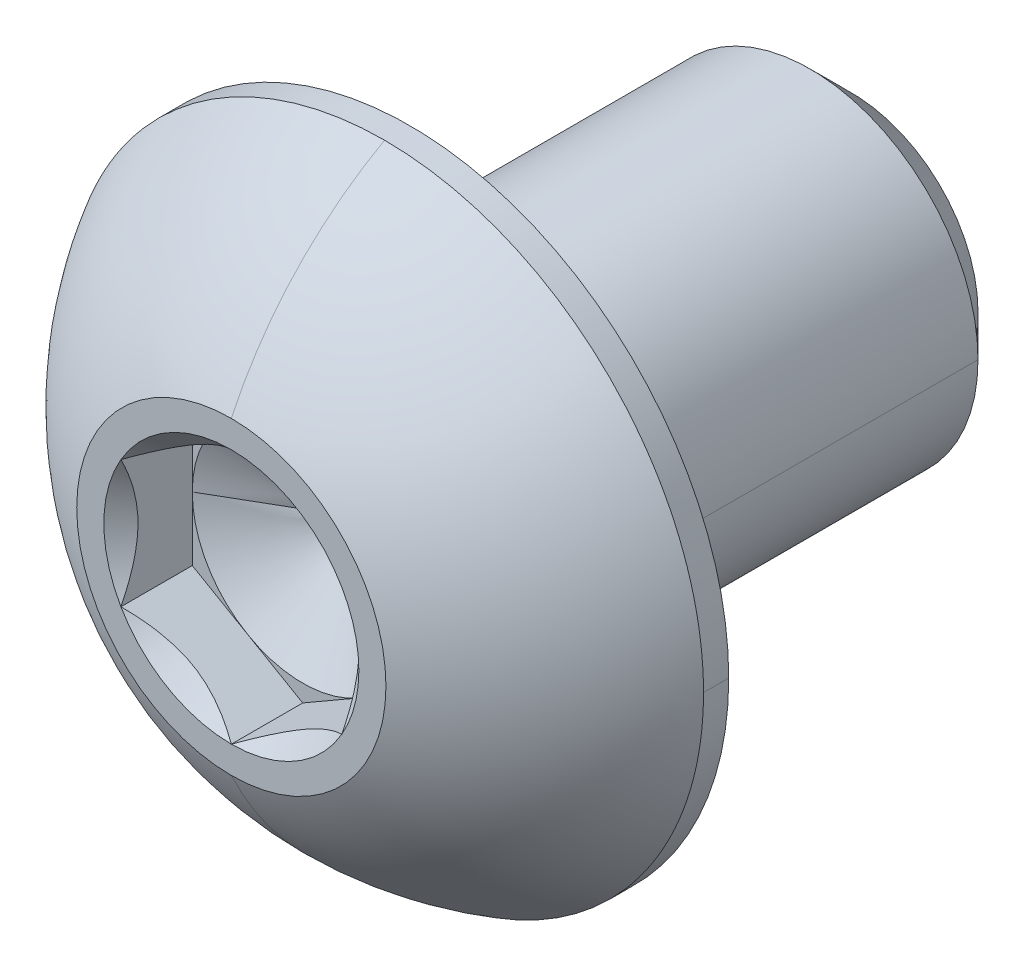
ISO-10303-21;
HEADER;
FILE_DESCRIPTION(('STEP AP214'),'2;1');
FILE_NAME('part.step','',(''),(''),'','','');
FILE_SCHEMA(('AUTOMOTIVE_DESIGN { 1 0 10303 214 1 1 1 1 }'));
ENDSEC;
DATA;
#1=APPLICATION_CONTEXT('core data for automotive mechanical design processes');
#2=APPLICATION_PROTOCOL_DEFINITION('international standard','automotive_design',2000,#1);
#3=PRODUCT_CONTEXT('',#1,'mechanical');
#4=PRODUCT('Part','Part','',(#3));
#5=PRODUCT_RELATED_PRODUCT_CATEGORY('part','',(#4));
#6=PRODUCT_DEFINITION_FORMATION('','',#4);
#7=PRODUCT_DEFINITION_CONTEXT('part definition',#1,'design');
#8=PRODUCT_DEFINITION('design','',#6,#7);
#9=PRODUCT_DEFINITION_SHAPE('','',#8);
#10=(LENGTH_UNIT() NAMED_UNIT(*) SI_UNIT(.MILLI.,.METRE.));
#11=(NAMED_UNIT(*) PLANE_ANGLE_UNIT() SI_UNIT($,.RADIAN.));
#12=(NAMED_UNIT(*) SI_UNIT($,.STERADIAN.) SOLID_ANGLE_UNIT());
#13=UNCERTAINTY_MEASURE_WITH_UNIT(LENGTH_MEASURE(1.E-05),#10,'distance_accuracy_value','');
#14=(GEOMETRIC_REPRESENTATION_CONTEXT(3) GLOBAL_UNCERTAINTY_ASSIGNED_CONTEXT((#13)) GLOBAL_UNIT_ASSIGNED_CONTEXT((#10,
#11,#12)) REPRESENTATION_CONTEXT('',''));
#15=CARTESIAN_POINT('',(0.,0.,0.));
#16=DIRECTION('',(0.,0.,1.));
#17=DIRECTION('',(1.,0.,0.));
#18=AXIS2_PLACEMENT_3D('',#15,#16,#17);
#19=CARTESIAN_POINT('',(0.,0.,4.4577));
#20=DIRECTION('',(0.,0.,1.));
#21=DIRECTION('',(1.,0.,0.));
#22=AXIS2_PLACEMENT_3D('',#19,#20,#21);
#23=CONICAL_SURFACE('',#22,1.83308710467706,0.78539816339745);
#24=CARTESIAN_POINT('',(0.,0.,4.4577));
#25=DIRECTION('',(0.,0.,1.));
#26=DIRECTION('',(1.,0.,0.));
#27=AXIS2_PLACEMENT_3D('',#24,#25,#26);
#28=CIRCLE('',#27,1.83308710467706);
#29=CARTESIAN_POINT('',(1.5875,0.916543552338531,4.4577));
#30=VERTEX_POINT('',#29);
#31=CARTESIAN_POINT('',(0.,1.83308710467706,4.4577));
#32=VERTEX_POINT('',#31);
#33=EDGE_CURVE('E561',#30,#32,#28,.T.);
#34=ORIENTED_EDGE('',*,*,#33,.T.);
#35=CARTESIAN_POINT('',(1.5875,0.916543552338532,4.4577));
#36=CARTESIAN_POINT('',(1.16394825928765,1.16108126385454,4.21316228848399));
#37=CARTESIAN_POINT('',(0.796673872668185,1.37312722983574,4.21211648546325));
#38=CARTESIAN_POINT('',(0.427185428296567,1.58645148265615,4.21106437797813));
#39=CARTESIAN_POINT('',(0.,1.83308710467706,4.4577));
#40=B_SPLINE_CURVE_WITH_KNOTS('',2,(#35,#36,#37,#38,#39),.UNSPECIFIED.,.F.,.F.,(3,2,3),(0.,0.5,
1.),.UNSPECIFIED.);
#41=EDGE_CURVE('E398',#30,#32,#40,.T.);
#42=ORIENTED_EDGE('',*,*,#41,.F.);
#43=EDGE_LOOP('',(#34,#42));
#44=FACE_BOUND('',#43,.T.);
#45=ADVANCED_FACE('F16',(#44),#23,.F.);
#46=CARTESIAN_POINT('',(0.,0.,4.4577));
#47=DIRECTION('',(0.,0.,1.));
#48=DIRECTION('',(1.,0.,0.));
#49=AXIS2_PLACEMENT_3D('',#46,#47,#48);
#50=CONICAL_SURFACE('',#49,1.83308710467706,0.78539816339745);
#51=DIRECTION('',(0.707106781186549,0.,0.707106781186546));
#52=VECTOR('',#51,1.);
#53=CARTESIAN_POINT('',(1.83308710467706,0.,4.4577));
#54=LINE('',#53,#52);
#55=CARTESIAN_POINT('',(1.5875,0.,4.21211289532294));
#56=VERTEX_POINT('',#55);
#57=CARTESIAN_POINT('',(1.83308710467706,0.,4.4577));
#58=VERTEX_POINT('',#57);
#59=EDGE_CURVE('E327',#56,#58,#54,.T.);
#60=ORIENTED_EDGE('',*,*,#59,.F.);
#61=CARTESIAN_POINT('',(1.5875,-0.916543552338531,4.4577));
#62=CARTESIAN_POINT('',(1.5875,-0.684378986321822,4.34161771699165));
#63=CARTESIAN_POINT('',(1.5875,-0.471870631820659,4.28075846355504));
#64=CARTESIAN_POINT('',(1.5875,-0.232174021608445,4.21211289532294));
#65=CARTESIAN_POINT('',(1.5875,0.,4.21211289532294));
#66=B_SPLINE_CURVE_WITH_KNOTS('',2,(#61,#62,#63,#64,#65),.UNSPECIFIED.,.F.,.F.,(3,2,3),(0.,0.5,
1.),.UNSPECIFIED.);
#67=CARTESIAN_POINT('',(1.5875,-0.916543552338531,4.4577));
#68=VERTEX_POINT('',#67);
#69=EDGE_CURVE('E164',#68,#56,#66,.T.);
#70=ORIENTED_EDGE('',*,*,#69,.F.);
#71=CARTESIAN_POINT('',(0.,0.,4.4577));
#72=DIRECTION('',(0.,0.,1.));
#73=DIRECTION('',(1.,0.,0.));
#74=AXIS2_PLACEMENT_3D('',#71,#72,#73);
#75=CIRCLE('',#74,1.83308710467706);
#76=EDGE_CURVE('E554',#68,#58,#75,.T.);
#77=ORIENTED_EDGE('',*,*,#76,.T.);
#78=EDGE_LOOP('',(#60,#70,#77));
#79=FACE_BOUND('',#78,.T.);
#80=ADVANCED_FACE('F18',(#79),#50,.F.);
#81=CARTESIAN_POINT('',(0.,0.,4.4577));
#82=DIRECTION('',(0.,0.,1.));
#83=DIRECTION('',(1.,0.,0.));
#84=AXIS2_PLACEMENT_3D('',#81,#82,#83);
#85=CONICAL_SURFACE('',#84,1.83308710467706,0.78539816339745);
#86=CARTESIAN_POINT('',(0.,0.,4.4577));
#87=DIRECTION('',(0.,0.,1.));
#88=DIRECTION('',(1.,0.,0.));
#89=AXIS2_PLACEMENT_3D('',#86,#87,#88);
#90=CIRCLE('',#89,1.83308710467706);
#91=CARTESIAN_POINT('',(0.,-1.83308710467706,4.4577));
#92=VERTEX_POINT('',#91);
#93=EDGE_CURVE('E546',#92,#68,#90,.T.);
#94=ORIENTED_EDGE('',*,*,#93,.T.);
#95=CARTESIAN_POINT('',(0.,-1.83308710467706,4.4577));
#96=CARTESIAN_POINT('',(0.423551740712977,-1.58854939316069,4.21316228848364));
#97=CARTESIAN_POINT('',(0.790826127331815,-1.37650342717985,4.21211648546325));
#98=CARTESIAN_POINT('',(1.16031457170405,-1.16317917435908,4.21106437797848));
#99=CARTESIAN_POINT('',(1.5875,-0.91654355233853,4.4577));
#100=B_SPLINE_CURVE_WITH_KNOTS('',2,(#95,#96,#97,#98,#99),.UNSPECIFIED.,.F.,.F.,(3,2,3),(0.,0.5,
1.),.UNSPECIFIED.);
#101=EDGE_CURVE('E269',#92,#68,#100,.T.);
#102=ORIENTED_EDGE('',*,*,#101,.F.);
#103=EDGE_LOOP('',(#94,#102));
#104=FACE_BOUND('',#103,.T.);
#105=ADVANCED_FACE('F528',(#104),#85,.F.);
#106=CARTESIAN_POINT('',(0.,0.,4.4577));
#107=DIRECTION('',(0.,0.,1.));
#108=DIRECTION('',(1.,0.,0.));
#109=AXIS2_PLACEMENT_3D('',#106,#107,#108);
#110=CONICAL_SURFACE('',#109,1.83308710467706,0.78539816339745);
#111=CARTESIAN_POINT('',(0.,0.,4.4577));
#112=DIRECTION('',(0.,0.,1.));
#113=DIRECTION('',(1.,0.,0.));
#114=AXIS2_PLACEMENT_3D('',#111,#112,#113);
#115=CIRCLE('',#114,1.83308710467706);
#116=CARTESIAN_POINT('',(-1.5875,-0.916543552338532,4.4577));
#117=VERTEX_POINT('',#116);
#118=EDGE_CURVE('E469',#117,#92,#115,.T.);
#119=ORIENTED_EDGE('',*,*,#118,.T.);
#120=CARTESIAN_POINT('',(-1.5875,-0.916543552338532,4.4577));
#121=CARTESIAN_POINT('',(-1.16394825928702,-1.1610812638549,4.21316228848363));
#122=CARTESIAN_POINT('',(-0.796673872668184,-1.37312722983575,4.21211648546325));
#123=CARTESIAN_POINT('',(-0.427185428295945,-1.58645148265651,4.21106437797848));
#124=CARTESIAN_POINT('',(0.,-1.83308710467706,4.4577));
#125=B_SPLINE_CURVE_WITH_KNOTS('',2,(#120,#121,#122,#123,#124),.UNSPECIFIED.,.F.,.F.,(3,2,3),
(0.,0.5,1.),.UNSPECIFIED.);
#126=EDGE_CURVE('E243',#117,#92,#125,.T.);
#127=ORIENTED_EDGE('',*,*,#126,.F.);
#128=EDGE_LOOP('',(#119,#127));
#129=FACE_BOUND('',#128,.T.);
#130=ADVANCED_FACE('F307',(#129),#110,.F.);
#131=CARTESIAN_POINT('',(0.,0.,4.4577));
#132=DIRECTION('',(0.,0.,1.));
#133=DIRECTION('',(1.,0.,0.));
#134=AXIS2_PLACEMENT_3D('',#131,#132,#133);
#135=CONICAL_SURFACE('',#134,1.83308710467706,0.78539816339745);
#136=CARTESIAN_POINT('',(0.,0.,4.4577));
#137=DIRECTION('',(0.,0.,1.));
#138=DIRECTION('',(1.,0.,0.));
#139=AXIS2_PLACEMENT_3D('',#136,#137,#138);
#140=CIRCLE('',#139,1.83308710467706);
#141=CARTESIAN_POINT('',(-1.5875,0.916543552338531,4.4577));
#142=VERTEX_POINT('',#141);
#143=EDGE_CURVE('E238',#142,#117,#140,.T.);
#144=ORIENTED_EDGE('',*,*,#143,.T.);
#145=CARTESIAN_POINT('',(-1.5875,0.916543552338531,4.4577));
#146=CARTESIAN_POINT('',(-1.5875,0.683298746669204,4.34107759716534));
#147=CARTESIAN_POINT('',(-1.5875,0.472019012921087,4.28080074655191));
#148=CARTESIAN_POINT('',(-1.5875,0.231534553260333,4.21219196144664));
#149=CARTESIAN_POINT('',(-1.5875,-1.26642650590545E-05,4.21211289537345));
#150=CARTESIAN_POINT('',(-1.5875,-0.230421051570486,4.21203421817487));
#151=CARTESIAN_POINT('',(-1.5875,-0.471876640894334,4.28076017567627));
#152=CARTESIAN_POINT('',(-1.5875,-0.6826489254774,4.34075268656943));
#153=CARTESIAN_POINT('',(-1.5875,-0.91654355233853,4.4577));
#154=B_SPLINE_CURVE_WITH_KNOTS('',2,(#145,#146,#147,#148,#149,#150,#151,#152,#153),
.UNSPECIFIED.,.F.,.F.,(3,2,2,2,3),(0.,0.25,0.5,0.75,1.),.UNSPECIFIED.);
#155=EDGE_CURVE('E463',#142,#117,#154,.T.);
#156=ORIENTED_EDGE('',*,*,#155,.F.);
#157=EDGE_LOOP('',(#144,#156));
#158=FACE_BOUND('',#157,.T.);
#159=ADVANCED_FACE('F414',(#158),#135,.F.);
#160=CARTESIAN_POINT('',(0.,0.,4.4577));
#161=DIRECTION('',(0.,0.,1.));
#162=DIRECTION('',(1.,0.,0.));
#163=AXIS2_PLACEMENT_3D('',#160,#161,#162);
#164=CONICAL_SURFACE('',#163,1.83308710467706,0.78539816339745);
#165=CARTESIAN_POINT('',(0.,0.,4.4577));
#166=DIRECTION('',(0.,0.,1.));
#167=DIRECTION('',(1.,0.,0.));
#168=AXIS2_PLACEMENT_3D('',#165,#166,#167);
#169=CIRCLE('',#168,1.83308710467706);
#170=EDGE_CURVE('E607',#32,#142,#169,.T.);
#171=ORIENTED_EDGE('',*,*,#170,.T.);
#172=CARTESIAN_POINT('',(0.,1.83308710467706,4.4577));
#173=CARTESIAN_POINT('',(-0.42355174071173,1.58854939316141,4.21316228848435));
#174=CARTESIAN_POINT('',(-0.790826127331815,1.37650342717985,4.21211648546325));
#175=CARTESIAN_POINT('',(-1.16031457170281,1.1631791743598,4.21106437797777));
#176=CARTESIAN_POINT('',(-1.5875,0.91654355233853,4.4577));
#177=B_SPLINE_CURVE_WITH_KNOTS('',2,(#172,#173,#174,#175,#176),.UNSPECIFIED.,.F.,.F.,(3,2,3),
(0.,0.5,1.),.UNSPECIFIED.);
#178=EDGE_CURVE('E513',#32,#142,#177,.T.);
#179=ORIENTED_EDGE('',*,*,#178,.F.);
#180=EDGE_LOOP('',(#171,#179));
#181=FACE_BOUND('',#180,.T.);
#182=ADVANCED_FACE('F519',(#181),#164,.F.);
#183=CARTESIAN_POINT('',(0.,0.,3.43154));
#184=DIRECTION('',(0.,0.,1.));
#185=DIRECTION('',(1.,0.,0.));
#186=AXIS2_PLACEMENT_3D('',#183,#184,#185);
#187=CONICAL_SURFACE('',#186,1.5875,1.0471975511966);
#188=DIRECTION('',(-0.86602540378444,0.,0.5));
#189=VECTOR('',#188,1.);
#190=CARTESIAN_POINT('',(-1.5875,0.,3.43154));
#191=LINE('',#190,#189);
#192=CARTESIAN_POINT('',(0.,0.,2.51499644766148));
#193=VERTEX_POINT('',#192);
#194=CARTESIAN_POINT('',(-1.5875,0.,3.43154));
#195=VERTEX_POINT('',#194);
#196=EDGE_CURVE('E194',#193,#195,#191,.T.);
#197=ORIENTED_EDGE('',*,*,#196,.F.);
#198=DIRECTION('',(0.86602540378444,0.,0.5));
#199=VECTOR('',#198,1.);
#200=CARTESIAN_POINT('',(1.5875,0.,3.43154));
#201=LINE('',#200,#199);
#202=CARTESIAN_POINT('',(1.5875,0.,3.43154));
#203=VERTEX_POINT('',#202);
#204=EDGE_CURVE('E227',#193,#203,#201,.T.);
#205=ORIENTED_EDGE('',*,*,#204,.T.);
#206=CARTESIAN_POINT('',(0.,0.,3.43154));
#207=DIRECTION('',(0.,0.,1.));
#208=DIRECTION('',(1.,0.,0.));
#209=AXIS2_PLACEMENT_3D('',#206,#207,#208);
#210=CIRCLE('',#209,1.5875);
#211=CARTESIAN_POINT('',(0.79375,1.3748153285078,3.43154));
#212=VERTEX_POINT('',#211);
#213=EDGE_CURVE('E11',#203,#212,#210,.T.);
#214=ORIENTED_EDGE('',*,*,#213,.T.);
#215=CARTESIAN_POINT('',(0.,0.,3.43154));
#216=DIRECTION('',(0.,0.,1.));
#217=DIRECTION('',(1.,0.,0.));
#218=AXIS2_PLACEMENT_3D('',#215,#216,#217);
#219=CIRCLE('',#218,1.5875);
#220=CARTESIAN_POINT('',(-0.79375,1.3748153285078,3.43154));
#221=VERTEX_POINT('',#220);
#222=EDGE_CURVE('E30',#212,#221,#219,.T.);
#223=ORIENTED_EDGE('',*,*,#222,.T.);
#224=CARTESIAN_POINT('',(0.,0.,3.43154));
#225=DIRECTION('',(0.,0.,1.));
#226=DIRECTION('',(1.,0.,0.));
#227=AXIS2_PLACEMENT_3D('',#224,#225,#226);
#228=CIRCLE('',#227,1.5875);
#229=EDGE_CURVE('E274',#221,#195,#228,.T.);
#230=ORIENTED_EDGE('',*,*,#229,.T.);
#231=EDGE_LOOP('',(#197,#205,#214,#223,#230));
#232=FACE_BOUND('',#231,.T.);
#233=ADVANCED_FACE('F496',(#232),#187,.F.);
#234=CARTESIAN_POINT('',(0.,0.,3.43154));
#235=DIRECTION('',(0.,0.,1.));
#236=DIRECTION('',(1.,0.,0.));
#237=AXIS2_PLACEMENT_3D('',#234,#235,#236);
#238=PLANE('',#237);
#239=ORIENTED_EDGE('',*,*,#213,.F.);
#240=DIRECTION('',(0.,1.,0.));
#241=VECTOR('',#240,1.);
#242=CARTESIAN_POINT('',(1.5875,-0.916543552338531,3.43154));
#243=LINE('',#242,#241);
#244=CARTESIAN_POINT('',(1.5875,0.916543552338532,3.43154));
#245=VERTEX_POINT('',#244);
#246=EDGE_CURVE('E254',#203,#245,#243,.T.);
#247=ORIENTED_EDGE('',*,*,#246,.T.);
#248=DIRECTION('',(-0.866025403784439,0.5,0.));
#249=VECTOR('',#248,1.);
#250=CARTESIAN_POINT('',(1.5875,0.916543552338532,3.43154));
#251=LINE('',#250,#249);
#252=EDGE_CURVE('E204',#245,#212,#251,.T.);
#253=ORIENTED_EDGE('',*,*,#252,.T.);
#254=EDGE_LOOP('',(#239,#247,#253));
#255=FACE_BOUND('',#254,.T.);
#256=ADVANCED_FACE('F305',(#255),#238,.T.);
#257=CARTESIAN_POINT('',(0.,0.,3.43154));
#258=DIRECTION('',(0.,0.,1.));
#259=DIRECTION('',(1.,0.,0.));
#260=AXIS2_PLACEMENT_3D('',#257,#258,#259);
#261=PLANE('',#260);
#262=ORIENTED_EDGE('',*,*,#222,.F.);
#263=DIRECTION('',(-0.866025403784439,0.5,0.));
#264=VECTOR('',#263,1.);
#265=CARTESIAN_POINT('',(1.5875,0.916543552338532,3.43154));
#266=LINE('',#265,#264);
#267=CARTESIAN_POINT('',(0.,1.83308710467706,3.43154));
#268=VERTEX_POINT('',#267);
#269=EDGE_CURVE('E200',#212,#268,#266,.T.);
#270=ORIENTED_EDGE('',*,*,#269,.T.);
#271=DIRECTION('',(-0.866025403784438,-0.5,0.));
#272=VECTOR('',#271,1.);
#273=CARTESIAN_POINT('',(0.,1.83308710467706,3.43154));
#274=LINE('',#273,#272);
#275=EDGE_CURVE('E668',#268,#221,#274,.T.);
#276=ORIENTED_EDGE('',*,*,#275,.T.);
#277=EDGE_LOOP('',(#262,#270,#276));
#278=FACE_BOUND('',#277,.T.);
#279=ADVANCED_FACE('F771',(#278),#261,.T.);
#280=CARTESIAN_POINT('',(0.,0.,3.43154));
#281=DIRECTION('',(0.,0.,1.));
#282=DIRECTION('',(1.,0.,0.));
#283=AXIS2_PLACEMENT_3D('',#280,#281,#282);
#284=PLANE('',#283);
#285=ORIENTED_EDGE('',*,*,#229,.F.);
#286=DIRECTION('',(-0.866025403784438,-0.5,0.));
#287=VECTOR('',#286,1.);
#288=CARTESIAN_POINT('',(0.,1.83308710467706,3.43154));
#289=LINE('',#288,#287);
#290=CARTESIAN_POINT('',(-1.5875,0.91654355233853,3.43154));
#291=VERTEX_POINT('',#290);
#292=EDGE_CURVE('E1095',#221,#291,#289,.T.);
#293=ORIENTED_EDGE('',*,*,#292,.T.);
#294=DIRECTION('',(0.,-1.,0.));
#295=VECTOR('',#294,1.);
#296=CARTESIAN_POINT('',(-1.5875,0.91654355233853,3.43154));
#297=LINE('',#296,#295);
#298=EDGE_CURVE('E239',#291,#195,#297,.T.);
#299=ORIENTED_EDGE('',*,*,#298,.T.);
#300=EDGE_LOOP('',(#285,#293,#299));
#301=FACE_BOUND('',#300,.T.);
#302=ADVANCED_FACE('F775',(#301),#284,.T.);
#303=CARTESIAN_POINT('',(0.,0.,3.43154));
#304=DIRECTION('',(0.,0.,1.));
#305=DIRECTION('',(1.,0.,0.));
#306=AXIS2_PLACEMENT_3D('',#303,#304,#305);
#307=PLANE('',#306);
#308=CARTESIAN_POINT('',(0.,0.,3.43154));
#309=DIRECTION('',(0.,0.,1.));
#310=DIRECTION('',(1.,0.,0.));
#311=AXIS2_PLACEMENT_3D('',#308,#309,#310);
#312=CIRCLE('',#311,1.5875);
#313=CARTESIAN_POINT('',(-0.79375,-1.3748153285078,3.43154));
#314=VERTEX_POINT('',#313);
#315=EDGE_CURVE('E187',#195,#314,#312,.T.);
#316=ORIENTED_EDGE('',*,*,#315,.F.);
#317=DIRECTION('',(0.,-1.,0.));
#318=VECTOR('',#317,1.);
#319=CARTESIAN_POINT('',(-1.5875,0.91654355233853,3.43154));
#320=LINE('',#319,#318);
#321=CARTESIAN_POINT('',(-1.5875,-0.916543552338532,3.43154));
#322=VERTEX_POINT('',#321);
#323=EDGE_CURVE('E244',#195,#322,#320,.T.);
#324=ORIENTED_EDGE('',*,*,#323,.T.);
#325=DIRECTION('',(0.866025403784439,-0.5,0.));
#326=VECTOR('',#325,1.);
#327=CARTESIAN_POINT('',(-1.5875,-0.916543552338532,3.43154));
#328=LINE('',#327,#326);
#329=EDGE_CURVE('E266',#322,#314,#328,.T.);
#330=ORIENTED_EDGE('',*,*,#329,.T.);
#331=EDGE_LOOP('',(#316,#324,#330));
#332=FACE_BOUND('',#331,.T.);
#333=ADVANCED_FACE('F381',(#332),#307,.T.);
#334=CARTESIAN_POINT('',(0.,0.,3.43154));
#335=DIRECTION('',(0.,0.,1.));
#336=DIRECTION('',(1.,0.,0.));
#337=AXIS2_PLACEMENT_3D('',#334,#335,#336);
#338=PLANE('',#337);
#339=CARTESIAN_POINT('',(0.,0.,3.43154));
#340=DIRECTION('',(0.,0.,1.));
#341=DIRECTION('',(1.,0.,0.));
#342=AXIS2_PLACEMENT_3D('',#339,#340,#341);
#343=CIRCLE('',#342,1.5875);
#344=CARTESIAN_POINT('',(0.79375,-1.3748153285078,3.43154));
#345=VERTEX_POINT('',#344);
#346=EDGE_CURVE('E156',#314,#345,#343,.T.);
#347=ORIENTED_EDGE('',*,*,#346,.F.);
#348=DIRECTION('',(0.866025403784439,-0.5,0.));
#349=VECTOR('',#348,1.);
#350=CARTESIAN_POINT('',(-1.5875,-0.916543552338532,3.43154));
#351=LINE('',#350,#349);
#352=CARTESIAN_POINT('',(0.,-1.83308710467706,3.43154));
#353=VERTEX_POINT('',#352);
#354=EDGE_CURVE('E159',#314,#353,#351,.T.);
#355=ORIENTED_EDGE('',*,*,#354,.T.);
#356=DIRECTION('',(0.866025403784438,0.5,0.));
#357=VECTOR('',#356,1.);
#358=CARTESIAN_POINT('',(0.,-1.83308710467706,3.43154));
#359=LINE('',#358,#357);
#360=EDGE_CURVE('E152',#353,#345,#359,.T.);
#361=ORIENTED_EDGE('',*,*,#360,.T.);
#362=EDGE_LOOP('',(#347,#355,#361));
#363=FACE_BOUND('',#362,.T.);
#364=ADVANCED_FACE('F154',(#363),#338,.T.);
#365=CARTESIAN_POINT('',(0.,0.,3.43154));
#366=DIRECTION('',(0.,0.,1.));
#367=DIRECTION('',(1.,0.,0.));
#368=AXIS2_PLACEMENT_3D('',#365,#366,#367);
#369=PLANE('',#368);
#370=CARTESIAN_POINT('',(0.,0.,3.43154));
#371=DIRECTION('',(0.,0.,1.));
#372=DIRECTION('',(1.,0.,0.));
#373=AXIS2_PLACEMENT_3D('',#370,#371,#372);
#374=CIRCLE('',#373,1.5875);
#375=EDGE_CURVE('E176',#345,#203,#374,.T.);
#376=ORIENTED_EDGE('',*,*,#375,.F.);
#377=DIRECTION('',(0.866025403784438,0.5,0.));
#378=VECTOR('',#377,1.);
#379=CARTESIAN_POINT('',(0.,-1.83308710467706,3.43154));
#380=LINE('',#379,#378);
#381=CARTESIAN_POINT('',(1.5875,-0.916543552338531,3.43154));
#382=VERTEX_POINT('',#381);
#383=EDGE_CURVE('E165',#345,#382,#380,.T.);
#384=ORIENTED_EDGE('',*,*,#383,.T.);
#385=DIRECTION('',(0.,1.,0.));
#386=VECTOR('',#385,1.);
#387=CARTESIAN_POINT('',(1.5875,-0.916543552338531,3.43154));
#388=LINE('',#387,#386);
#389=EDGE_CURVE('E45',#382,#203,#388,.T.);
#390=ORIENTED_EDGE('',*,*,#389,.T.);
#391=EDGE_LOOP('',(#376,#384,#390));
#392=FACE_BOUND('',#391,.T.);
#393=ADVANCED_FACE('F177',(#392),#369,.T.);
#394=CARTESIAN_POINT('',(1.5875,-0.916543552338531,4.4577));
#395=DIRECTION('',(-1.,0.,0.));
#396=DIRECTION('',(0.,1.,0.));
#397=AXIS2_PLACEMENT_3D('',#394,#395,#396);
#398=PLANE('',#397);
#399=ORIENTED_EDGE('',*,*,#69,.T.);
#400=CARTESIAN_POINT('',(1.5875,0.,4.21211289532294));
#401=CARTESIAN_POINT('',(1.5875,0.229762965263553,4.21211289532294));
#402=CARTESIAN_POINT('',(1.5875,0.472025034449919,4.28080246271759));
#403=CARTESIAN_POINT('',(1.5875,0.681581043057824,4.34021874535965));
#404=CARTESIAN_POINT('',(1.5875,0.916543552338529,4.4577));
#405=B_SPLINE_CURVE_WITH_KNOTS('',2,(#400,#401,#402,#403,#404),.UNSPECIFIED.,.F.,.F.,(3,2,3),
(0.,0.5,1.),.UNSPECIFIED.);
#406=EDGE_CURVE('E325',#56,#30,#405,.T.);
#407=ORIENTED_EDGE('',*,*,#406,.T.);
#408=DIRECTION('',(0.,0.,-1.));
#409=VECTOR('',#408,1.);
#410=CARTESIAN_POINT('',(1.5875,0.916543552338532,4.4577));
#411=LINE('',#410,#409);
#412=EDGE_CURVE('E273',#30,#245,#411,.T.);
#413=ORIENTED_EDGE('',*,*,#412,.T.);
#414=ORIENTED_EDGE('',*,*,#246,.F.);
#415=ORIENTED_EDGE('',*,*,#389,.F.);
#416=DIRECTION('',(0.,0.,-1.));
#417=VECTOR('',#416,1.);
#418=CARTESIAN_POINT('',(1.5875,-0.916543552338531,4.4577));
#419=LINE('',#418,#417);
#420=EDGE_CURVE('E171',#68,#382,#419,.T.);
#421=ORIENTED_EDGE('',*,*,#420,.F.);
#422=EDGE_LOOP('',(#399,#407,#413,#414,#415,#421));
#423=FACE_BOUND('',#422,.T.);
#424=ADVANCED_FACE('F295',(#423),#398,.T.);
#425=CARTESIAN_POINT('',(0.,-1.83308710467706,4.4577));
#426=DIRECTION('',(-0.5,0.866025403784438,0.));
#427=DIRECTION('',(0.,0.,1.));
#428=AXIS2_PLACEMENT_3D('',#425,#426,#427);
#429=PLANE('',#428);
#430=ORIENTED_EDGE('',*,*,#101,.T.);
#431=ORIENTED_EDGE('',*,*,#420,.T.);
#432=ORIENTED_EDGE('',*,*,#383,.F.);
#433=ORIENTED_EDGE('',*,*,#360,.F.);
#434=DIRECTION('',(0.,0.,-1.));
#435=VECTOR('',#434,1.);
#436=CARTESIAN_POINT('',(0.,-1.83308710467706,4.4577));
#437=LINE('',#436,#435);
#438=EDGE_CURVE('E535',#92,#353,#437,.T.);
#439=ORIENTED_EDGE('',*,*,#438,.F.);
#440=EDGE_LOOP('',(#430,#431,#432,#433,#439));
#441=FACE_BOUND('',#440,.T.);
#442=ADVANCED_FACE('F170',(#441),#429,.T.);
#443=CARTESIAN_POINT('',(-1.5875,-0.916543552338532,4.4577));
#444=DIRECTION('',(0.5,0.866025403784439,0.));
#445=DIRECTION('',(0.,0.,-1.));
#446=AXIS2_PLACEMENT_3D('',#443,#444,#445);
#447=PLANE('',#446);
#448=ORIENTED_EDGE('',*,*,#126,.T.);
#449=ORIENTED_EDGE('',*,*,#438,.T.);
#450=ORIENTED_EDGE('',*,*,#354,.F.);
#451=ORIENTED_EDGE('',*,*,#329,.F.);
#452=DIRECTION('',(0.,0.,-1.));
#453=VECTOR('',#452,1.);
#454=CARTESIAN_POINT('',(-1.5875,-0.916543552338532,4.4577));
#455=LINE('',#454,#453);
#456=EDGE_CURVE('E262',#117,#322,#455,.T.);
#457=ORIENTED_EDGE('',*,*,#456,.F.);
#458=EDGE_LOOP('',(#448,#449,#450,#451,#457));
#459=FACE_BOUND('',#458,.T.);
#460=ADVANCED_FACE('F368',(#459),#447,.T.);
#461=CARTESIAN_POINT('',(-1.5875,0.91654355233853,4.4577));
#462=DIRECTION('',(1.,0.,0.));
#463=DIRECTION('',(0.,1.,0.));
#464=AXIS2_PLACEMENT_3D('',#461,#462,#463);
#465=PLANE('',#464);
#466=ORIENTED_EDGE('',*,*,#155,.T.);
#467=ORIENTED_EDGE('',*,*,#456,.T.);
#468=ORIENTED_EDGE('',*,*,#323,.F.);
#469=ORIENTED_EDGE('',*,*,#298,.F.);
#470=DIRECTION('',(0.,0.,-1.));
#471=VECTOR('',#470,1.);
#472=CARTESIAN_POINT('',(-1.5875,0.91654355233853,4.4577));
#473=LINE('',#472,#471);
#474=EDGE_CURVE('E621',#142,#291,#473,.T.);
#475=ORIENTED_EDGE('',*,*,#474,.F.);
#476=EDGE_LOOP('',(#466,#467,#468,#469,#475));
#477=FACE_BOUND('',#476,.T.);
#478=ADVANCED_FACE('F434',(#477),#465,.T.);
#479=CARTESIAN_POINT('',(0.,1.83308710467706,4.4577));
#480=DIRECTION('',(0.5,-0.866025403784438,0.));
#481=DIRECTION('',(0.,0.,-1.));
#482=AXIS2_PLACEMENT_3D('',#479,#480,#481);
#483=PLANE('',#482);
#484=ORIENTED_EDGE('',*,*,#178,.T.);
#485=ORIENTED_EDGE('',*,*,#474,.T.);
#486=ORIENTED_EDGE('',*,*,#292,.F.);
#487=ORIENTED_EDGE('',*,*,#275,.F.);
#488=DIRECTION('',(0.,0.,-1.));
#489=VECTOR('',#488,1.);
#490=CARTESIAN_POINT('',(0.,1.83308710467706,4.4577));
#491=LINE('',#490,#489);
#492=EDGE_CURVE('E205',#32,#268,#491,.T.);
#493=ORIENTED_EDGE('',*,*,#492,.F.);
#494=EDGE_LOOP('',(#484,#485,#486,#487,#493));
#495=FACE_BOUND('',#494,.T.);
#496=ADVANCED_FACE('F379',(#495),#483,.T.);
#497=CARTESIAN_POINT('',(1.5875,0.916543552338532,4.4577));
#498=DIRECTION('',(-0.5,-0.866025403784439,0.));
#499=DIRECTION('',(-0.866025403784439,0.5,0.));
#500=AXIS2_PLACEMENT_3D('',#497,#498,#499);
#501=PLANE('',#500);
#502=ORIENTED_EDGE('',*,*,#41,.T.);
#503=ORIENTED_EDGE('',*,*,#492,.T.);
#504=ORIENTED_EDGE('',*,*,#269,.F.);
#505=ORIENTED_EDGE('',*,*,#252,.F.);
#506=ORIENTED_EDGE('',*,*,#412,.F.);
#507=EDGE_LOOP('',(#502,#503,#504,#505,#506));
#508=FACE_BOUND('',#507,.T.);
#509=ADVANCED_FACE('F375',(#508),#501,.T.);
#510=CARTESIAN_POINT('',(0.,1.8176748,-4.4577));
#511=DIRECTION('',(0.,0.,1.));
#512=DIRECTION('',(1.,0.,0.));
#513=AXIS2_PLACEMENT_3D('',#510,#511,#512);
#514=PLANE('',#513);
#515=CARTESIAN_POINT('',(0.,0.,-4.4577));
#516=DIRECTION('',(0.,0.,1.));
#517=DIRECTION('',(1.,0.,0.));
#518=AXIS2_PLACEMENT_3D('',#515,#516,#517);
#519=CIRCLE('',#518,1.8176748);
#520=CARTESIAN_POINT('',(1.8176748,0.,-4.4577));
#521=VERTEX_POINT('',#520);
#522=CARTESIAN_POINT('',(-1.8176748,0.,-4.4577));
#523=VERTEX_POINT('',#522);
#524=EDGE_CURVE('E221',#521,#523,#519,.T.);
#525=ORIENTED_EDGE('',*,*,#524,.F.);
#526=CARTESIAN_POINT('',(0.,0.,-4.4577));
#527=DIRECTION('',(0.,0.,1.));
#528=DIRECTION('',(1.,0.,0.));
#529=AXIS2_PLACEMENT_3D('',#526,#527,#528);
#530=CIRCLE('',#529,1.8176748);
#531=EDGE_CURVE('E234',#523,#521,#530,.T.);
#532=ORIENTED_EDGE('',*,*,#531,.F.);
#533=EDGE_LOOP('',(#525,#532));
#534=FACE_BOUND('',#533,.T.);
#535=ADVANCED_FACE('F371',(#534),#514,.F.);
#536=CARTESIAN_POINT('',(0.,0.,-0.293890374205693));
#537=DIRECTION('',(-1.,0.,0.));
#538=DIRECTION('',(0.,1.,0.));
#539=AXIS2_PLACEMENT_3D('',#536,#537,#538);
#540=SPHERICAL_SURFACE('',#539,5.24567606074224);
#541=CARTESIAN_POINT('',(0.,0.,-0.293890374205693));
#542=DIRECTION('',(-1.,0.,0.));
#543=DIRECTION('',(0.,-1.,0.));
#544=AXIS2_PLACEMENT_3D('',#541,#542,#543);
#545=CIRCLE('',#544,5.24567606074224);
#546=CARTESIAN_POINT('',(0.,-4.5847,2.25515714285714));
#547=VERTEX_POINT('',#546);
#548=CARTESIAN_POINT('',(0.,-2.2225,4.4577));
#549=VERTEX_POINT('',#548);
#550=EDGE_CURVE('E206',#547,#549,#545,.T.);
#551=ORIENTED_EDGE('',*,*,#550,.F.);
#552=CARTESIAN_POINT('',(0.,0.,2.25515714285714));
#553=DIRECTION('',(0.,0.,1.));
#554=DIRECTION('',(1.,0.,0.));
#555=AXIS2_PLACEMENT_3D('',#552,#553,#554);
#556=CIRCLE('',#555,4.5847);
#557=CARTESIAN_POINT('',(4.5847,0.,2.25515714285714));
#558=VERTEX_POINT('',#557);
#559=EDGE_CURVE('E225',#547,#558,#556,.T.);
#560=ORIENTED_EDGE('',*,*,#559,.T.);
#561=CARTESIAN_POINT('',(0.,0.,2.25515714285714));
#562=DIRECTION('',(0.,0.,1.));
#563=DIRECTION('',(1.,0.,0.));
#564=AXIS2_PLACEMENT_3D('',#561,#562,#563);
#565=CIRCLE('',#564,4.5847);
#566=CARTESIAN_POINT('',(0.,4.5847,2.25515714285714));
#567=VERTEX_POINT('',#566);
#568=EDGE_CURVE('E285',#558,#567,#565,.T.);
#569=ORIENTED_EDGE('',*,*,#568,.T.);
#570=CARTESIAN_POINT('',(0.,0.,-0.293890374205693));
#571=DIRECTION('',(1.,0.,0.));
#572=DIRECTION('',(0.,0.,-1.));
#573=AXIS2_PLACEMENT_3D('',#570,#571,#572);
#574=CIRCLE('',#573,5.24567606074224);
#575=CARTESIAN_POINT('',(0.,2.2225,4.4577));
#576=VERTEX_POINT('',#575);
#577=EDGE_CURVE('E211',#567,#576,#574,.T.);
#578=ORIENTED_EDGE('',*,*,#577,.T.);
#579=CARTESIAN_POINT('',(0.,0.,4.4577));
#580=DIRECTION('',(0.,0.,1.));
#581=DIRECTION('',(1.,0.,0.));
#582=AXIS2_PLACEMENT_3D('',#579,#580,#581);
#583=CIRCLE('',#582,2.2225);
#584=EDGE_CURVE('E605',#549,#576,#583,.T.);
#585=ORIENTED_EDGE('',*,*,#584,.F.);
#586=EDGE_LOOP('',(#551,#560,#569,#578,#585));
#587=FACE_BOUND('',#586,.T.);
#588=ADVANCED_FACE('F374',(#587),#540,.T.);
#589=CARTESIAN_POINT('',(0.,0.,4.4577));
#590=DIRECTION('',(0.,0.,1.));
#591=DIRECTION('',(1.,0.,0.));
#592=AXIS2_PLACEMENT_3D('',#589,#590,#591);
#593=CYLINDRICAL_SURFACE('',#592,4.5847);
#594=DIRECTION('',(0.,0.,1.));
#595=VECTOR('',#594,1.);
#596=CARTESIAN_POINT('',(-4.5847,0.,4.4577));
#597=LINE('',#596,#595);
#598=CARTESIAN_POINT('',(-4.5847,0.,1.8923));
#599=VERTEX_POINT('',#598);
#600=CARTESIAN_POINT('',(-4.5847,0.,2.25515714285714));
#601=VERTEX_POINT('',#600);
#602=EDGE_CURVE('E1110',#599,#601,#597,.T.);
#603=ORIENTED_EDGE('',*,*,#602,.F.);
#604=CARTESIAN_POINT('',(0.,0.,1.8923));
#605=DIRECTION('',(0.,0.,1.));
#606=DIRECTION('',(1.,0.,0.));
#607=AXIS2_PLACEMENT_3D('',#604,#605,#606);
#608=CIRCLE('',#607,4.5847);
#609=CARTESIAN_POINT('',(4.5847,0.,1.8923));
#610=VERTEX_POINT('',#609);
#611=EDGE_CURVE('E222',#599,#610,#608,.T.);
#612=ORIENTED_EDGE('',*,*,#611,.T.);
#613=DIRECTION('',(0.,0.,1.));
#614=VECTOR('',#613,1.);
#615=CARTESIAN_POINT('',(4.5847,0.,4.4577));
#616=LINE('',#615,#614);
#617=EDGE_CURVE('E280',#610,#558,#616,.T.);
#618=ORIENTED_EDGE('',*,*,#617,.T.);
#619=ORIENTED_EDGE('',*,*,#559,.F.);
#620=CARTESIAN_POINT('',(0.,0.,2.25515714285714));
#621=DIRECTION('',(0.,0.,1.));
#622=DIRECTION('',(1.,0.,0.));
#623=AXIS2_PLACEMENT_3D('',#620,#621,#622);
#624=CIRCLE('',#623,4.5847);
#625=EDGE_CURVE('E182',#601,#547,#624,.T.);
#626=ORIENTED_EDGE('',*,*,#625,.F.);
#627=EDGE_LOOP('',(#603,#612,#618,#619,#626));
#628=FACE_BOUND('',#627,.T.);
#629=ADVANCED_FACE('F369',(#628),#593,.T.);
#630=CARTESIAN_POINT('',(0.,4.5847,1.8923));
#631=DIRECTION('',(0.,0.,1.));
#632=DIRECTION('',(1.,0.,0.));
#633=AXIS2_PLACEMENT_3D('',#630,#631,#632);
#634=PLANE('',#633);
#635=CARTESIAN_POINT('',(0.,0.,1.8923));
#636=DIRECTION('',(0.,0.,1.));
#637=DIRECTION('',(1.,0.,0.));
#638=AXIS2_PLACEMENT_3D('',#635,#636,#637);
#639=CIRCLE('',#638,2.413);
#640=CARTESIAN_POINT('',(2.413,0.,1.8923));
#641=VERTEX_POINT('',#640);
#642=CARTESIAN_POINT('',(-2.413,0.,1.8923));
#643=VERTEX_POINT('',#642);
#644=EDGE_CURVE('E245',#641,#643,#639,.T.);
#645=ORIENTED_EDGE('',*,*,#644,.T.);
#646=CARTESIAN_POINT('',(0.,0.,1.8923));
#647=DIRECTION('',(0.,0.,1.));
#648=DIRECTION('',(1.,0.,0.));
#649=AXIS2_PLACEMENT_3D('',#646,#647,#648);
#650=CIRCLE('',#649,2.413);
#651=EDGE_CURVE('E226',#643,#641,#650,.T.);
#652=ORIENTED_EDGE('',*,*,#651,.T.);
#653=EDGE_LOOP('',(#645,#652));
#654=FACE_BOUND('',#653,.T.);
#655=CARTESIAN_POINT('',(0.,0.,1.8923));
#656=DIRECTION('',(0.,0.,1.));
#657=DIRECTION('',(1.,0.,0.));
#658=AXIS2_PLACEMENT_3D('',#655,#656,#657);
#659=CIRCLE('',#658,4.5847);
#660=EDGE_CURVE('E627',#610,#599,#659,.T.);
#661=ORIENTED_EDGE('',*,*,#660,.F.);
#662=ORIENTED_EDGE('',*,*,#611,.F.);
#663=EDGE_LOOP('',(#661,#662));
#664=FACE_BOUND('',#663,.T.);
#665=ADVANCED_FACE('F417',(#654,#664),#634,.F.);
#666=CARTESIAN_POINT('',(0.,0.,4.4577));
#667=DIRECTION('',(0.,0.,1.));
#668=DIRECTION('',(1.,0.,0.));
#669=AXIS2_PLACEMENT_3D('',#666,#667,#668);
#670=CYLINDRICAL_SURFACE('',#669,2.413);
#671=DIRECTION('',(0.,0.,1.));
#672=VECTOR('',#671,1.);
#673=CARTESIAN_POINT('',(-2.413,0.,4.4577));
#674=LINE('',#673,#672);
#675=CARTESIAN_POINT('',(-2.413,0.,-3.8623748));
#676=VERTEX_POINT('',#675);
#677=EDGE_CURVE('E250',#676,#643,#674,.T.);
#678=ORIENTED_EDGE('',*,*,#677,.F.);
#679=CARTESIAN_POINT('',(0.,0.,-3.8623748));
#680=DIRECTION('',(0.,0.,1.));
#681=DIRECTION('',(1.,0.,0.));
#682=AXIS2_PLACEMENT_3D('',#679,#680,#681);
#683=CIRCLE('',#682,2.413);
#684=CARTESIAN_POINT('',(2.413,0.,-3.8623748));
#685=VERTEX_POINT('',#684);
#686=EDGE_CURVE('E197',#676,#685,#683,.T.);
#687=ORIENTED_EDGE('',*,*,#686,.T.);
#688=DIRECTION('',(0.,0.,1.));
#689=VECTOR('',#688,1.);
#690=CARTESIAN_POINT('',(2.413,0.,4.4577));
#691=LINE('',#690,#689);
#692=EDGE_CURVE('E249',#685,#641,#691,.T.);
#693=ORIENTED_EDGE('',*,*,#692,.T.);
#694=ORIENTED_EDGE('',*,*,#651,.F.);
#695=EDGE_LOOP('',(#678,#687,#693,#694));
#696=FACE_BOUND('',#695,.T.);
#697=ADVANCED_FACE('F420',(#696),#670,.T.);
#698=CARTESIAN_POINT('',(0.,0.,-4.4577));
#699=DIRECTION('',(0.,0.,1.));
#700=DIRECTION('',(1.,0.,0.));
#701=AXIS2_PLACEMENT_3D('',#698,#699,#700);
#702=CONICAL_SURFACE('',#701,1.8176748,0.785398163397446);
#703=DIRECTION('',(-0.707106781186546,0.,0.707106781186549));
#704=VECTOR('',#703,1.);
#705=CARTESIAN_POINT('',(-1.8176748,0.,-4.4577));
#706=LINE('',#705,#704);
#707=EDGE_CURVE('E216',#523,#676,#706,.T.);
#708=ORIENTED_EDGE('',*,*,#707,.F.);
#709=ORIENTED_EDGE('',*,*,#531,.T.);
#710=DIRECTION('',(0.707106781186546,0.,0.707106781186549));
#711=VECTOR('',#710,1.);
#712=CARTESIAN_POINT('',(1.8176748,0.,-4.4577));
#713=LINE('',#712,#711);
#714=EDGE_CURVE('E220',#521,#685,#713,.T.);
#715=ORIENTED_EDGE('',*,*,#714,.T.);
#716=ORIENTED_EDGE('',*,*,#686,.F.);
#717=EDGE_LOOP('',(#708,#709,#715,#716));
#718=FACE_BOUND('',#717,.T.);
#719=ADVANCED_FACE('F751',(#718),#702,.T.);
#720=CARTESIAN_POINT('',(0.,1.5875,4.4577));
#721=DIRECTION('',(0.,0.,-1.));
#722=DIRECTION('',(0.,-1.,0.));
#723=AXIS2_PLACEMENT_3D('',#720,#721,#722);
#724=PLANE('',#723);
#725=ORIENTED_EDGE('',*,*,#170,.F.);
#726=ORIENTED_EDGE('',*,*,#33,.F.);
#727=CARTESIAN_POINT('',(0.,0.,4.4577));
#728=DIRECTION('',(0.,0.,1.));
#729=DIRECTION('',(1.,0.,0.));
#730=AXIS2_PLACEMENT_3D('',#727,#728,#729);
#731=CIRCLE('',#730,1.83308710467706);
#732=EDGE_CURVE('E230',#58,#30,#731,.T.);
#733=ORIENTED_EDGE('',*,*,#732,.F.);
#734=ORIENTED_EDGE('',*,*,#76,.F.);
#735=ORIENTED_EDGE('',*,*,#93,.F.);
#736=ORIENTED_EDGE('',*,*,#118,.F.);
#737=ORIENTED_EDGE('',*,*,#143,.F.);
#738=EDGE_LOOP('',(#725,#726,#733,#734,#735,#736,#737));
#739=FACE_BOUND('',#738,.T.);
#740=CARTESIAN_POINT('',(0.,0.,4.4577));
#741=DIRECTION('',(0.,0.,1.));
#742=DIRECTION('',(1.,0.,0.));
#743=AXIS2_PLACEMENT_3D('',#740,#741,#742);
#744=CIRCLE('',#743,2.2225);
#745=EDGE_CURVE('E210',#576,#549,#744,.T.);
#746=ORIENTED_EDGE('',*,*,#745,.T.);
#747=ORIENTED_EDGE('',*,*,#584,.T.);
#748=EDGE_LOOP('',(#746,#747));
#749=FACE_BOUND('',#748,.T.);
#750=ADVANCED_FACE('F490',(#739,#749),#724,.F.);
#751=CARTESIAN_POINT('',(0.,0.,-4.4577));
#752=DIRECTION('',(0.,0.,1.));
#753=DIRECTION('',(1.,0.,0.));
#754=AXIS2_PLACEMENT_3D('',#751,#752,#753);
#755=CONICAL_SURFACE('',#754,1.8176748,0.785398163397446);
#756=ORIENTED_EDGE('',*,*,#524,.T.);
#757=ORIENTED_EDGE('',*,*,#707,.T.);
#758=CARTESIAN_POINT('',(0.,0.,-3.8623748));
#759=DIRECTION('',(0.,0.,1.));
#760=DIRECTION('',(1.,0.,0.));
#761=AXIS2_PLACEMENT_3D('',#758,#759,#760);
#762=CIRCLE('',#761,2.413);
#763=EDGE_CURVE('E284',#685,#676,#762,.T.);
#764=ORIENTED_EDGE('',*,*,#763,.F.);
#765=ORIENTED_EDGE('',*,*,#714,.F.);
#766=EDGE_LOOP('',(#756,#757,#764,#765));
#767=FACE_BOUND('',#766,.T.);
#768=ADVANCED_FACE('F426',(#767),#755,.T.);
#769=CARTESIAN_POINT('',(0.,0.,4.4577));
#770=DIRECTION('',(0.,0.,1.));
#771=DIRECTION('',(1.,0.,0.));
#772=AXIS2_PLACEMENT_3D('',#769,#770,#771);
#773=CYLINDRICAL_SURFACE('',#772,2.413);
#774=ORIENTED_EDGE('',*,*,#763,.T.);
#775=ORIENTED_EDGE('',*,*,#677,.T.);
#776=ORIENTED_EDGE('',*,*,#644,.F.);
#777=ORIENTED_EDGE('',*,*,#692,.F.);
#778=EDGE_LOOP('',(#774,#775,#776,#777));
#779=FACE_BOUND('',#778,.T.);
#780=ADVANCED_FACE('F422',(#779),#773,.T.);
#781=CARTESIAN_POINT('',(0.,0.,4.4577));
#782=DIRECTION('',(0.,0.,1.));
#783=DIRECTION('',(1.,0.,0.));
#784=AXIS2_PLACEMENT_3D('',#781,#782,#783);
#785=CYLINDRICAL_SURFACE('',#784,4.5847);
#786=ORIENTED_EDGE('',*,*,#660,.T.);
#787=ORIENTED_EDGE('',*,*,#602,.T.);
#788=CARTESIAN_POINT('',(0.,0.,2.25515714285714));
#789=DIRECTION('',(0.,0.,1.));
#790=DIRECTION('',(1.,0.,0.));
#791=AXIS2_PLACEMENT_3D('',#788,#789,#790);
#792=CIRCLE('',#791,4.5847);
#793=EDGE_CURVE('E215',#567,#601,#792,.T.);
#794=ORIENTED_EDGE('',*,*,#793,.F.);
#795=ORIENTED_EDGE('',*,*,#568,.F.);
#796=ORIENTED_EDGE('',*,*,#617,.F.);
#797=EDGE_LOOP('',(#786,#787,#794,#795,#796));
#798=FACE_BOUND('',#797,.T.);
#799=ADVANCED_FACE('F425',(#798),#785,.T.);
#800=CARTESIAN_POINT('',(0.,0.,-0.293890374205693));
#801=DIRECTION('',(-1.,0.,0.));
#802=DIRECTION('',(0.,1.,0.));
#803=AXIS2_PLACEMENT_3D('',#800,#801,#802);
#804=SPHERICAL_SURFACE('',#803,5.24567606074224);
#805=ORIENTED_EDGE('',*,*,#625,.T.);
#806=ORIENTED_EDGE('',*,*,#550,.T.);
#807=ORIENTED_EDGE('',*,*,#745,.F.);
#808=ORIENTED_EDGE('',*,*,#577,.F.);
#809=ORIENTED_EDGE('',*,*,#793,.T.);
#810=EDGE_LOOP('',(#805,#806,#807,#808,#809));
#811=FACE_BOUND('',#810,.T.);
#812=ADVANCED_FACE('F735',(#811),#804,.T.);
#813=CARTESIAN_POINT('',(0.,0.,3.43154));
#814=DIRECTION('',(0.,0.,1.));
#815=DIRECTION('',(1.,0.,0.));
#816=AXIS2_PLACEMENT_3D('',#813,#814,#815);
#817=CONICAL_SURFACE('',#816,1.5875,1.0471975511966);
#818=ORIENTED_EDGE('',*,*,#204,.F.);
#819=ORIENTED_EDGE('',*,*,#196,.T.);
#820=ORIENTED_EDGE('',*,*,#315,.T.);
#821=ORIENTED_EDGE('',*,*,#346,.T.);
#822=ORIENTED_EDGE('',*,*,#375,.T.);
#823=EDGE_LOOP('',(#818,#819,#820,#821,#822));
#824=FACE_BOUND('',#823,.T.);
#825=ADVANCED_FACE('F184',(#824),#817,.F.);
#826=CARTESIAN_POINT('',(0.,0.,4.4577));
#827=DIRECTION('',(0.,0.,1.));
#828=DIRECTION('',(1.,0.,0.));
#829=AXIS2_PLACEMENT_3D('',#826,#827,#828);
#830=CONICAL_SURFACE('',#829,1.83308710467706,0.78539816339745);
#831=ORIENTED_EDGE('',*,*,#406,.F.);
#832=ORIENTED_EDGE('',*,*,#59,.T.);
#833=ORIENTED_EDGE('',*,*,#732,.T.);
#834=EDGE_LOOP('',(#831,#832,#833));
#835=FACE_BOUND('',#834,.T.);
#836=ADVANCED_FACE('F326',(#835),#830,.F.);
#837=CLOSED_SHELL('',(#45,#80,#105,#130,#159,#182,#233,#256,#279,#302,#333,#364,#393,#424,#442,
#460,#478,#496,#509,#535,#588,#629,#665,#697,#719,#750,#768,#780,#799,#812,#825,#836));
#838=MANIFOLD_SOLID_BREP('B1',#837);
#839=ADVANCED_BREP_SHAPE_REPRESENTATION('',(#18,#838),#14);
#840=SHAPE_DEFINITION_REPRESENTATION(#9,#839);
ENDSEC;
END-ISO-10303-21;
